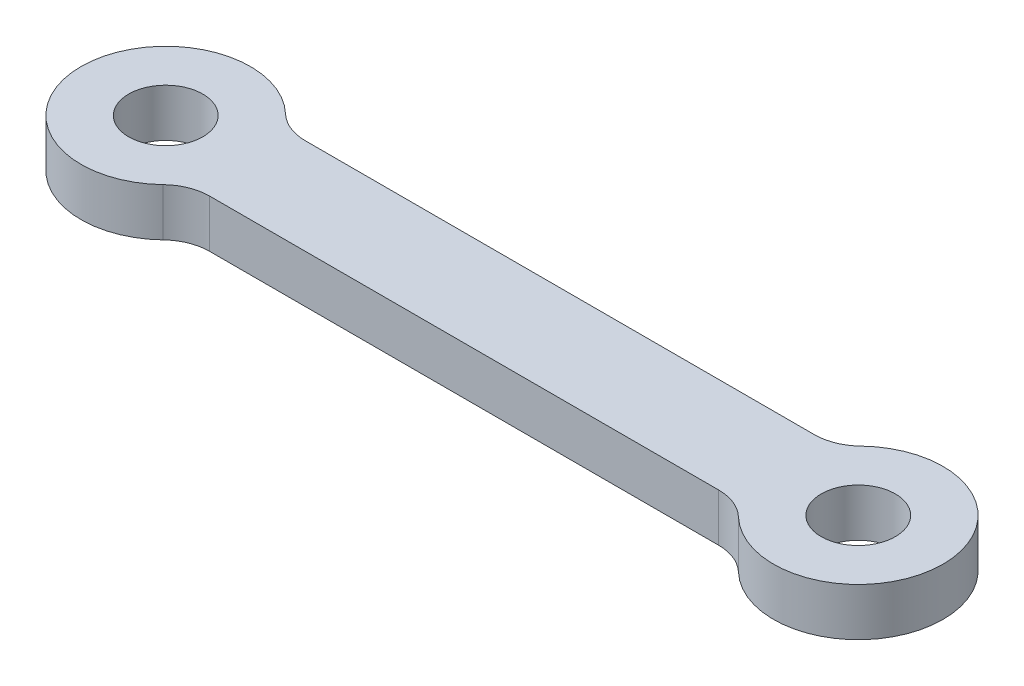
ISO-10303-21;
HEADER;
FILE_DESCRIPTION(('STEP AP214'),'2;1');
FILE_NAME('part.step','',(''),(''),'','','');
FILE_SCHEMA(('AUTOMOTIVE_DESIGN { 1 0 10303 214 1 1 1 1 }'));
ENDSEC;
DATA;
#1=APPLICATION_CONTEXT('core data for automotive mechanical design processes');
#2=APPLICATION_PROTOCOL_DEFINITION('international standard','automotive_design',2000,#1);
#3=PRODUCT_CONTEXT('',#1,'mechanical');
#4=PRODUCT('Part','Part','',(#3));
#5=PRODUCT_RELATED_PRODUCT_CATEGORY('part','',(#4));
#6=PRODUCT_DEFINITION_FORMATION('','',#4);
#7=PRODUCT_DEFINITION_CONTEXT('part definition',#1,'design');
#8=PRODUCT_DEFINITION('design','',#6,#7);
#9=PRODUCT_DEFINITION_SHAPE('','',#8);
#10=(LENGTH_UNIT() NAMED_UNIT(*) SI_UNIT(.MILLI.,.METRE.));
#11=(NAMED_UNIT(*) PLANE_ANGLE_UNIT() SI_UNIT($,.RADIAN.));
#12=(NAMED_UNIT(*) SI_UNIT($,.STERADIAN.) SOLID_ANGLE_UNIT());
#13=UNCERTAINTY_MEASURE_WITH_UNIT(LENGTH_MEASURE(1.E-05),#10,'distance_accuracy_value','');
#14=(GEOMETRIC_REPRESENTATION_CONTEXT(3) GLOBAL_UNCERTAINTY_ASSIGNED_CONTEXT((#13)) GLOBAL_UNIT_ASSIGNED_CONTEXT((#10,
#11,#12)) REPRESENTATION_CONTEXT('',''));
#15=CARTESIAN_POINT('',(0.,0.,0.));
#16=DIRECTION('',(0.,0.,1.));
#17=DIRECTION('',(1.,0.,0.));
#18=AXIS2_PLACEMENT_3D('',#15,#16,#17);
#19=CARTESIAN_POINT('',(0.,10.,-10.));
#20=DIRECTION('',(0.,0.,-1.));
#21=DIRECTION('',(-1.,0.,0.));
#22=AXIS2_PLACEMENT_3D('',#19,#20,#21);
#23=PLANE('',#22);
#24=DIRECTION('',(1.,0.,0.));
#25=VECTOR('',#24,1.);
#26=CARTESIAN_POINT('',(0.,10.,-10.));
#27=LINE('',#26,#25);
#28=CARTESIAN_POINT('',(19.1669628463559,10.,-10.));
#29=VERTEX_POINT('',#28);
#30=CARTESIAN_POINT('',(125.468187312555,10.,-10.));
#31=VERTEX_POINT('',#30);
#32=EDGE_CURVE('E203',#29,#31,#27,.T.);
#33=ORIENTED_EDGE('',*,*,#32,.T.);
#34=DIRECTION('',(0.,-1.,0.));
#35=VECTOR('',#34,1.);
#36=CARTESIAN_POINT('',(125.468187312555,10.,-10.));
#37=LINE('',#36,#35);
#38=CARTESIAN_POINT('',(125.468187312555,0.,-10.));
#39=VERTEX_POINT('',#38);
#40=EDGE_CURVE('E132',#31,#39,#37,.T.);
#41=ORIENTED_EDGE('',*,*,#40,.T.);
#42=DIRECTION('',(1.,0.,0.));
#43=VECTOR('',#42,1.);
#44=CARTESIAN_POINT('',(0.,0.,-10.));
#45=LINE('',#44,#43);
#46=CARTESIAN_POINT('',(19.1669628463559,0.,-10.));
#47=VERTEX_POINT('',#46);
#48=EDGE_CURVE('E115',#47,#39,#45,.T.);
#49=ORIENTED_EDGE('',*,*,#48,.F.);
#50=DIRECTION('',(0.,-1.,0.));
#51=VECTOR('',#50,1.);
#52=CARTESIAN_POINT('',(19.1669628463559,10.,-10.));
#53=LINE('',#52,#51);
#54=EDGE_CURVE('E129',#47,#29,#53,.F.);
#55=ORIENTED_EDGE('',*,*,#54,.T.);
#56=EDGE_LOOP('',(#33,#41,#49,#55));
#57=FACE_BOUND('',#56,.T.);
#58=ADVANCED_FACE('F45',(#57),#23,.T.);
#59=CARTESIAN_POINT('',(0.,10.,0.));
#60=DIRECTION('',(0.,-1.,0.));
#61=DIRECTION('',(0.,0.,-1.));
#62=AXIS2_PLACEMENT_3D('',#59,#60,#61);
#63=CYLINDRICAL_SURFACE('',#62,17.7014884934652);
#64=CARTESIAN_POINT('',(0.,10.,0.));
#65=DIRECTION('',(0.,1.,0.));
#66=DIRECTION('',(0.,0.,1.));
#67=AXIS2_PLACEMENT_3D('',#64,#65,#66);
#68=CIRCLE('',#67,17.7014884934652);
#69=CARTESIAN_POINT('',(12.2478534812121,10.,-12.7801713598466));
#70=VERTEX_POINT('',#69);
#71=CARTESIAN_POINT('',(12.2478534812121,10.,12.7801713598466));
#72=VERTEX_POINT('',#71);
#73=EDGE_CURVE('E197',#70,#72,#68,.T.);
#74=ORIENTED_EDGE('',*,*,#73,.F.);
#75=DIRECTION('',(0.,-1.,0.));
#76=VECTOR('',#75,1.);
#77=CARTESIAN_POINT('',(12.2478534812121,10.,-12.7801713598466));
#78=LINE('',#77,#76);
#79=CARTESIAN_POINT('',(12.2478534812121,0.,-12.7801713598466));
#80=VERTEX_POINT('',#79);
#81=EDGE_CURVE('E160',#70,#80,#78,.T.);
#82=ORIENTED_EDGE('',*,*,#81,.T.);
#83=CARTESIAN_POINT('',(0.,0.,0.));
#84=DIRECTION('',(0.,1.,0.));
#85=DIRECTION('',(0.,0.,1.));
#86=AXIS2_PLACEMENT_3D('',#83,#84,#85);
#87=CIRCLE('',#86,17.7014884934652);
#88=CARTESIAN_POINT('',(12.2478534812121,0.,12.7801713598466));
#89=VERTEX_POINT('',#88);
#90=EDGE_CURVE('E117',#80,#89,#87,.T.);
#91=ORIENTED_EDGE('',*,*,#90,.T.);
#92=DIRECTION('',(0.,-1.,0.));
#93=VECTOR('',#92,1.);
#94=CARTESIAN_POINT('',(12.2478534812121,10.,12.7801713598466));
#95=LINE('',#94,#93);
#96=EDGE_CURVE('E157',#89,#72,#95,.F.);
#97=ORIENTED_EDGE('',*,*,#96,.T.);
#98=EDGE_LOOP('',(#74,#82,#91,#97));
#99=FACE_BOUND('',#98,.T.);
#100=ADVANCED_FACE('F189',(#99),#63,.T.);
#101=CARTESIAN_POINT('',(0.,10.,10.));
#102=DIRECTION('',(0.,0.,-1.));
#103=DIRECTION('',(-1.,0.,0.));
#104=AXIS2_PLACEMENT_3D('',#101,#102,#103);
#105=PLANE('',#104);
#106=DIRECTION('',(1.,0.,0.));
#107=VECTOR('',#106,1.);
#108=CARTESIAN_POINT('',(0.,0.,10.));
#109=LINE('',#108,#107);
#110=CARTESIAN_POINT('',(19.1669628463559,0.,10.));
#111=VERTEX_POINT('',#110);
#112=CARTESIAN_POINT('',(125.468187312555,0.,10.));
#113=VERTEX_POINT('',#112);
#114=EDGE_CURVE('E183',#111,#113,#109,.T.);
#115=ORIENTED_EDGE('',*,*,#114,.T.);
#116=DIRECTION('',(0.,1.,0.));
#117=VECTOR('',#116,1.);
#118=CARTESIAN_POINT('',(125.468187312555,10.,10.));
#119=LINE('',#118,#117);
#120=CARTESIAN_POINT('',(125.468187312555,10.,10.));
#121=VERTEX_POINT('',#120);
#122=EDGE_CURVE('E61',#113,#121,#119,.T.);
#123=ORIENTED_EDGE('',*,*,#122,.T.);
#124=DIRECTION('',(1.,0.,0.));
#125=VECTOR('',#124,1.);
#126=CARTESIAN_POINT('',(0.,10.,10.));
#127=LINE('',#126,#125);
#128=CARTESIAN_POINT('',(19.1669628463559,10.,10.));
#129=VERTEX_POINT('',#128);
#130=EDGE_CURVE('E193',#129,#121,#127,.T.);
#131=ORIENTED_EDGE('',*,*,#130,.F.);
#132=DIRECTION('',(0.,1.,0.));
#133=VECTOR('',#132,1.);
#134=CARTESIAN_POINT('',(19.1669628463559,0.,10.));
#135=LINE('',#134,#133);
#136=EDGE_CURVE('E163',#129,#111,#135,.F.);
#137=ORIENTED_EDGE('',*,*,#136,.T.);
#138=EDGE_LOOP('',(#115,#123,#131,#137));
#139=FACE_BOUND('',#138,.T.);
#140=ADVANCED_FACE('F192',(#139),#105,.F.);
#141=CARTESIAN_POINT('',(144.635150158911,10.,0.));
#142=DIRECTION('',(0.,-1.,0.));
#143=DIRECTION('',(0.,0.,-1.));
#144=AXIS2_PLACEMENT_3D('',#141,#142,#143);
#145=CYLINDRICAL_SURFACE('',#144,7.74440121589106);
#146=CARTESIAN_POINT('',(144.635150158911,10.,0.));
#147=DIRECTION('',(0.,1.,0.));
#148=DIRECTION('',(0.,0.,1.));
#149=AXIS2_PLACEMENT_3D('',#146,#147,#148);
#150=CIRCLE('',#149,7.74440121589106);
#151=CARTESIAN_POINT('',(144.635150158911,10.,7.74440121589106));
#152=VERTEX_POINT('',#151);
#153=EDGE_CURVE('E145',#152,#152,#150,.T.);
#154=ORIENTED_EDGE('',*,*,#153,.T.);
#155=EDGE_LOOP('',(#154));
#156=FACE_BOUND('',#155,.T.);
#157=CARTESIAN_POINT('',(144.635150158911,0.,0.));
#158=DIRECTION('',(0.,1.,0.));
#159=DIRECTION('',(0.,0.,1.));
#160=AXIS2_PLACEMENT_3D('',#157,#158,#159);
#161=CIRCLE('',#160,7.74440121589106);
#162=CARTESIAN_POINT('',(144.635150158911,0.,7.74440121589106));
#163=VERTEX_POINT('',#162);
#164=EDGE_CURVE('E215',#163,#163,#161,.T.);
#165=ORIENTED_EDGE('',*,*,#164,.F.);
#166=EDGE_LOOP('',(#165));
#167=FACE_BOUND('',#166,.T.);
#168=ADVANCED_FACE('F250',(#156,#167),#145,.F.);
#169=CARTESIAN_POINT('',(144.635150158911,10.,0.));
#170=DIRECTION('',(0.,-1.,0.));
#171=DIRECTION('',(0.,0.,-1.));
#172=AXIS2_PLACEMENT_3D('',#169,#170,#171);
#173=CYLINDRICAL_SURFACE('',#172,17.7014884934652);
#174=CARTESIAN_POINT('',(144.635150158911,0.,0.));
#175=DIRECTION('',(0.,1.,0.));
#176=DIRECTION('',(0.,0.,1.));
#177=AXIS2_PLACEMENT_3D('',#174,#175,#176);
#178=CIRCLE('',#177,17.7014884934652);
#179=CARTESIAN_POINT('',(132.387296677699,0.,12.7801713598466));
#180=VERTEX_POINT('',#179);
#181=CARTESIAN_POINT('',(132.387296677699,0.,-12.7801713598466));
#182=VERTEX_POINT('',#181);
#183=EDGE_CURVE('E212',#180,#182,#178,.T.);
#184=ORIENTED_EDGE('',*,*,#183,.T.);
#185=DIRECTION('',(0.,-1.,0.));
#186=VECTOR('',#185,1.);
#187=CARTESIAN_POINT('',(132.387296677699,10.,-12.7801713598466));
#188=LINE('',#187,#186);
#189=CARTESIAN_POINT('',(132.387296677699,10.,-12.7801713598466));
#190=VERTEX_POINT('',#189);
#191=EDGE_CURVE('E154',#182,#190,#188,.F.);
#192=ORIENTED_EDGE('',*,*,#191,.T.);
#193=CARTESIAN_POINT('',(144.635150158911,10.,0.));
#194=DIRECTION('',(0.,1.,0.));
#195=DIRECTION('',(0.,0.,1.));
#196=AXIS2_PLACEMENT_3D('',#193,#194,#195);
#197=CIRCLE('',#196,17.7014884934652);
#198=CARTESIAN_POINT('',(132.387296677699,10.,12.7801713598466));
#199=VERTEX_POINT('',#198);
#200=EDGE_CURVE('E196',#199,#190,#197,.T.);
#201=ORIENTED_EDGE('',*,*,#200,.F.);
#202=DIRECTION('',(0.,-1.,0.));
#203=VECTOR('',#202,1.);
#204=CARTESIAN_POINT('',(132.387296677699,10.,12.7801713598466));
#205=LINE('',#204,#203);
#206=EDGE_CURVE('E142',#199,#180,#205,.T.);
#207=ORIENTED_EDGE('',*,*,#206,.T.);
#208=EDGE_LOOP('',(#184,#192,#201,#207));
#209=FACE_BOUND('',#208,.T.);
#210=ADVANCED_FACE('F230',(#209),#173,.T.);
#211=CARTESIAN_POINT('',(0.,10.,0.));
#212=DIRECTION('',(0.,-1.,0.));
#213=DIRECTION('',(0.,0.,-1.));
#214=AXIS2_PLACEMENT_3D('',#211,#212,#213);
#215=CYLINDRICAL_SURFACE('',#214,7.74440121589104);
#216=CARTESIAN_POINT('',(0.,10.,0.));
#217=DIRECTION('',(0.,1.,0.));
#218=DIRECTION('',(0.,0.,1.));
#219=AXIS2_PLACEMENT_3D('',#216,#217,#218);
#220=CIRCLE('',#219,7.74440121589104);
#221=CARTESIAN_POINT('',(0.,10.,7.74440121589104));
#222=VERTEX_POINT('',#221);
#223=EDGE_CURVE('E138',#222,#222,#220,.T.);
#224=ORIENTED_EDGE('',*,*,#223,.T.);
#225=EDGE_LOOP('',(#224));
#226=FACE_BOUND('',#225,.T.);
#227=CARTESIAN_POINT('',(0.,0.,0.));
#228=DIRECTION('',(0.,1.,0.));
#229=DIRECTION('',(0.,0.,1.));
#230=AXIS2_PLACEMENT_3D('',#227,#228,#229);
#231=CIRCLE('',#230,7.74440121589104);
#232=CARTESIAN_POINT('',(0.,0.,7.74440121589104));
#233=VERTEX_POINT('',#232);
#234=EDGE_CURVE('E148',#233,#233,#231,.T.);
#235=ORIENTED_EDGE('',*,*,#234,.F.);
#236=EDGE_LOOP('',(#235));
#237=FACE_BOUND('',#236,.T.);
#238=ADVANCED_FACE('F238',(#226,#237),#215,.F.);
#239=CARTESIAN_POINT('',(0.,10.,0.));
#240=DIRECTION('',(0.,1.,0.));
#241=DIRECTION('',(0.,0.,1.));
#242=AXIS2_PLACEMENT_3D('',#239,#240,#241);
#243=PLANE('',#242);
#244=ORIENTED_EDGE('',*,*,#32,.F.);
#245=CARTESIAN_POINT('',(19.1669628463559,10.,-20.));
#246=DIRECTION('',(0.,1.,0.));
#247=DIRECTION('',(0.,0.,1.));
#248=AXIS2_PLACEMENT_3D('',#245,#246,#247);
#249=CIRCLE('',#248,10.);
#250=EDGE_CURVE('E123',#29,#70,#249,.F.);
#251=ORIENTED_EDGE('',*,*,#250,.T.);
#252=ORIENTED_EDGE('',*,*,#73,.T.);
#253=CARTESIAN_POINT('',(19.1669628463559,10.,20.));
#254=DIRECTION('',(0.,1.,0.));
#255=DIRECTION('',(0.,0.,1.));
#256=AXIS2_PLACEMENT_3D('',#253,#254,#255);
#257=CIRCLE('',#256,10.);
#258=EDGE_CURVE('E11',#72,#129,#257,.F.);
#259=ORIENTED_EDGE('',*,*,#258,.T.);
#260=ORIENTED_EDGE('',*,*,#130,.T.);
#261=CARTESIAN_POINT('',(125.468187312555,10.,20.));
#262=DIRECTION('',(0.,1.,0.));
#263=DIRECTION('',(0.,0.,1.));
#264=AXIS2_PLACEMENT_3D('',#261,#262,#263);
#265=CIRCLE('',#264,10.);
#266=EDGE_CURVE('E179',#121,#199,#265,.F.);
#267=ORIENTED_EDGE('',*,*,#266,.T.);
#268=ORIENTED_EDGE('',*,*,#200,.T.);
#269=CARTESIAN_POINT('',(125.468187312555,10.,-20.));
#270=DIRECTION('',(0.,1.,0.));
#271=DIRECTION('',(0.,0.,1.));
#272=AXIS2_PLACEMENT_3D('',#269,#270,#271);
#273=CIRCLE('',#272,10.);
#274=EDGE_CURVE('E124',#190,#31,#273,.F.);
#275=ORIENTED_EDGE('',*,*,#274,.T.);
#276=EDGE_LOOP('',(#244,#251,#252,#259,#260,#267,#268,#275));
#277=FACE_BOUND('',#276,.T.);
#278=ORIENTED_EDGE('',*,*,#153,.F.);
#279=EDGE_LOOP('',(#278));
#280=FACE_BOUND('',#279,.T.);
#281=ORIENTED_EDGE('',*,*,#223,.F.);
#282=EDGE_LOOP('',(#281));
#283=FACE_BOUND('',#282,.T.);
#284=ADVANCED_FACE('F235',(#277,#280,#283),#243,.T.);
#285=CARTESIAN_POINT('',(0.,0.,0.));
#286=DIRECTION('',(0.,1.,0.));
#287=DIRECTION('',(0.,0.,1.));
#288=AXIS2_PLACEMENT_3D('',#285,#286,#287);
#289=PLANE('',#288);
#290=ORIENTED_EDGE('',*,*,#90,.F.);
#291=CARTESIAN_POINT('',(19.1669628463559,0.,-20.));
#292=DIRECTION('',(0.,1.,0.));
#293=DIRECTION('',(0.,0.,1.));
#294=AXIS2_PLACEMENT_3D('',#291,#292,#293);
#295=CIRCLE('',#294,10.);
#296=EDGE_CURVE('E111',#80,#47,#295,.T.);
#297=ORIENTED_EDGE('',*,*,#296,.T.);
#298=ORIENTED_EDGE('',*,*,#48,.T.);
#299=CARTESIAN_POINT('',(125.468187312555,0.,-20.));
#300=DIRECTION('',(0.,1.,0.));
#301=DIRECTION('',(0.,0.,1.));
#302=AXIS2_PLACEMENT_3D('',#299,#300,#301);
#303=CIRCLE('',#302,10.);
#304=EDGE_CURVE('E169',#39,#182,#303,.T.);
#305=ORIENTED_EDGE('',*,*,#304,.T.);
#306=ORIENTED_EDGE('',*,*,#183,.F.);
#307=CARTESIAN_POINT('',(125.468187312555,0.,20.));
#308=DIRECTION('',(0.,1.,0.));
#309=DIRECTION('',(0.,0.,1.));
#310=AXIS2_PLACEMENT_3D('',#307,#308,#309);
#311=CIRCLE('',#310,10.);
#312=EDGE_CURVE('E176',#180,#113,#311,.T.);
#313=ORIENTED_EDGE('',*,*,#312,.T.);
#314=ORIENTED_EDGE('',*,*,#114,.F.);
#315=CARTESIAN_POINT('',(19.1669628463559,0.,20.));
#316=DIRECTION('',(0.,1.,0.));
#317=DIRECTION('',(0.,0.,1.));
#318=AXIS2_PLACEMENT_3D('',#315,#316,#317);
#319=CIRCLE('',#318,10.);
#320=EDGE_CURVE('E54',#111,#89,#319,.T.);
#321=ORIENTED_EDGE('',*,*,#320,.T.);
#322=EDGE_LOOP('',(#290,#297,#298,#305,#306,#313,#314,#321));
#323=FACE_BOUND('',#322,.T.);
#324=ORIENTED_EDGE('',*,*,#164,.T.);
#325=EDGE_LOOP('',(#324));
#326=FACE_BOUND('',#325,.T.);
#327=ORIENTED_EDGE('',*,*,#234,.T.);
#328=EDGE_LOOP('',(#327));
#329=FACE_BOUND('',#328,.T.);
#330=ADVANCED_FACE('F113',(#323,#326,#329),#289,.F.);
#331=CARTESIAN_POINT('',(125.468187312555,10.,-20.));
#332=DIRECTION('',(0.,-1.,0.));
#333=DIRECTION('',(0.,0.,-1.));
#334=AXIS2_PLACEMENT_3D('',#331,#332,#333);
#335=CYLINDRICAL_SURFACE('',#334,10.);
#336=ORIENTED_EDGE('',*,*,#274,.F.);
#337=ORIENTED_EDGE('',*,*,#191,.F.);
#338=ORIENTED_EDGE('',*,*,#304,.F.);
#339=ORIENTED_EDGE('',*,*,#40,.F.);
#340=EDGE_LOOP('',(#336,#337,#338,#339));
#341=FACE_BOUND('',#340,.T.);
#342=ADVANCED_FACE('F226',(#341),#335,.F.);
#343=CARTESIAN_POINT('',(19.1669628463559,10.,-20.));
#344=DIRECTION('',(0.,-1.,0.));
#345=DIRECTION('',(0.,0.,-1.));
#346=AXIS2_PLACEMENT_3D('',#343,#344,#345);
#347=CYLINDRICAL_SURFACE('',#346,10.);
#348=ORIENTED_EDGE('',*,*,#250,.F.);
#349=ORIENTED_EDGE('',*,*,#54,.F.);
#350=ORIENTED_EDGE('',*,*,#296,.F.);
#351=ORIENTED_EDGE('',*,*,#81,.F.);
#352=EDGE_LOOP('',(#348,#349,#350,#351));
#353=FACE_BOUND('',#352,.T.);
#354=ADVANCED_FACE('F136',(#353),#347,.F.);
#355=CARTESIAN_POINT('',(125.468187312555,10.,20.));
#356=DIRECTION('',(0.,-1.,0.));
#357=DIRECTION('',(0.,0.,-1.));
#358=AXIS2_PLACEMENT_3D('',#355,#356,#357);
#359=CYLINDRICAL_SURFACE('',#358,10.);
#360=ORIENTED_EDGE('',*,*,#266,.F.);
#361=ORIENTED_EDGE('',*,*,#122,.F.);
#362=ORIENTED_EDGE('',*,*,#312,.F.);
#363=ORIENTED_EDGE('',*,*,#206,.F.);
#364=EDGE_LOOP('',(#360,#361,#362,#363));
#365=FACE_BOUND('',#364,.T.);
#366=ADVANCED_FACE('F234',(#365),#359,.F.);
#367=CARTESIAN_POINT('',(19.1669628463559,10.,20.));
#368=DIRECTION('',(0.,-1.,0.));
#369=DIRECTION('',(0.,0.,-1.));
#370=AXIS2_PLACEMENT_3D('',#367,#368,#369);
#371=CYLINDRICAL_SURFACE('',#370,10.);
#372=ORIENTED_EDGE('',*,*,#258,.F.);
#373=ORIENTED_EDGE('',*,*,#96,.F.);
#374=ORIENTED_EDGE('',*,*,#320,.F.);
#375=ORIENTED_EDGE('',*,*,#136,.F.);
#376=EDGE_LOOP('',(#372,#373,#374,#375));
#377=FACE_BOUND('',#376,.T.);
#378=ADVANCED_FACE('F47',(#377),#371,.F.);
#379=CLOSED_SHELL('',(#58,#100,#140,#168,#210,#238,#284,#330,#342,#354,#366,#378));
#380=MANIFOLD_SOLID_BREP('B2',#379);
#381=ADVANCED_BREP_SHAPE_REPRESENTATION('',(#18,#380),#14);
#382=SHAPE_DEFINITION_REPRESENTATION(#9,#381);
ENDSEC;
END-ISO-10303-21;
